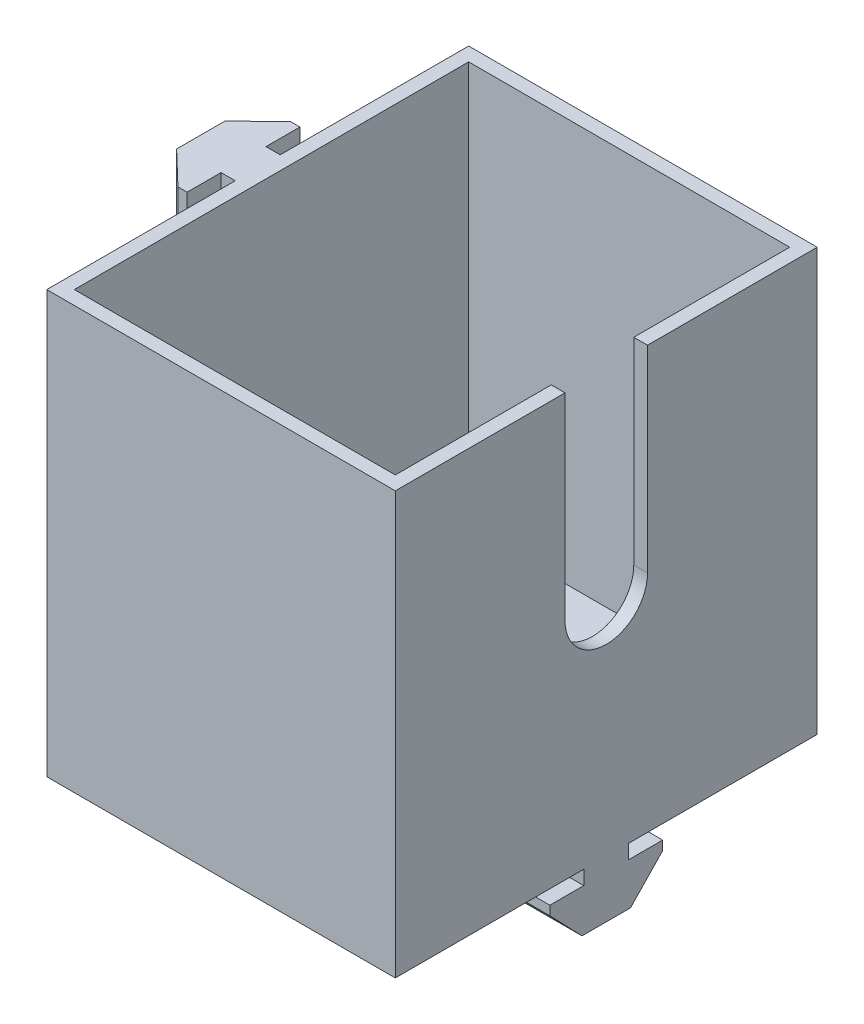
ISO-10303-21;
HEADER;
FILE_DESCRIPTION(('STEP AP214'),'2;1');
FILE_NAME('part.step','',(''),(''),'','','');
FILE_SCHEMA(('AUTOMOTIVE_DESIGN { 1 0 10303 214 1 1 1 1 }'));
ENDSEC;
DATA;
#1=APPLICATION_CONTEXT('core data for automotive mechanical design processes');
#2=APPLICATION_PROTOCOL_DEFINITION('international standard','automotive_design',2000,#1);
#3=PRODUCT_CONTEXT('',#1,'mechanical');
#4=PRODUCT('Part','Part','',(#3));
#5=PRODUCT_RELATED_PRODUCT_CATEGORY('part','',(#4));
#6=PRODUCT_DEFINITION_FORMATION('','',#4);
#7=PRODUCT_DEFINITION_CONTEXT('part definition',#1,'design');
#8=PRODUCT_DEFINITION('design','',#6,#7);
#9=PRODUCT_DEFINITION_SHAPE('','',#8);
#10=(LENGTH_UNIT() NAMED_UNIT(*) SI_UNIT(.MILLI.,.METRE.));
#11=(NAMED_UNIT(*) PLANE_ANGLE_UNIT() SI_UNIT($,.RADIAN.));
#12=(NAMED_UNIT(*) SI_UNIT($,.STERADIAN.) SOLID_ANGLE_UNIT());
#13=UNCERTAINTY_MEASURE_WITH_UNIT(LENGTH_MEASURE(1.E-05),#10,'distance_accuracy_value','');
#14=(GEOMETRIC_REPRESENTATION_CONTEXT(3) GLOBAL_UNCERTAINTY_ASSIGNED_CONTEXT((#13)) GLOBAL_UNIT_ASSIGNED_CONTEXT((#10,
#11,#12)) REPRESENTATION_CONTEXT('',''));
#15=CARTESIAN_POINT('',(0.,0.,0.));
#16=DIRECTION('',(0.,0.,1.));
#17=DIRECTION('',(1.,0.,0.));
#18=AXIS2_PLACEMENT_3D('',#15,#16,#17);
#19=CARTESIAN_POINT('',(22.1,26.1,52.2));
#20=DIRECTION('',(-1.,0.,0.));
#21=DIRECTION('',(0.,-1.,0.));
#22=AXIS2_PLACEMENT_3D('',#19,#20,#21);
#23=PLANE('',#22);
#24=CARTESIAN_POINT('',(22.1,4.6,26.1));
#25=DIRECTION('',(-1.,0.,0.));
#26=DIRECTION('',(0.,-1.,0.));
#27=AXIS2_PLACEMENT_3D('',#24,#25,#26);
#28=CIRCLE('',#27,4.5);
#29=CARTESIAN_POINT('',(22.1,4.6,21.6));
#30=VERTEX_POINT('',#29);
#31=CARTESIAN_POINT('',(22.1,4.6,30.6));
#32=VERTEX_POINT('',#31);
#33=EDGE_CURVE('E53',#30,#32,#28,.T.);
#34=ORIENTED_EDGE('',*,*,#33,.T.);
#35=DIRECTION('',(0.,1.,0.));
#36=VECTOR('',#35,1.);
#37=CARTESIAN_POINT('',(22.1,26.1,30.6));
#38=LINE('',#37,#36);
#39=CARTESIAN_POINT('',(22.1,26.1,30.6));
#40=VERTEX_POINT('',#39);
#41=EDGE_CURVE('E258',#32,#40,#38,.T.);
#42=ORIENTED_EDGE('',*,*,#41,.T.);
#43=DIRECTION('',(0.,0.,-1.));
#44=VECTOR('',#43,1.);
#45=CARTESIAN_POINT('',(22.1,26.1,52.2));
#46=LINE('',#45,#44);
#47=CARTESIAN_POINT('',(22.1,26.1,49.1));
#48=VERTEX_POINT('',#47);
#49=EDGE_CURVE('E41',#48,#40,#46,.T.);
#50=ORIENTED_EDGE('',*,*,#49,.F.);
#51=DIRECTION('',(0.,-1.,0.));
#52=VECTOR('',#51,1.);
#53=CARTESIAN_POINT('',(22.1,198.903184518172,49.1));
#54=LINE('',#53,#52);
#55=CARTESIAN_POINT('',(22.1,-19.9,49.1));
#56=VERTEX_POINT('',#55);
#57=EDGE_CURVE('E315',#48,#56,#54,.T.);
#58=ORIENTED_EDGE('',*,*,#57,.T.);
#59=DIRECTION('',(0.,0.,1.));
#60=VECTOR('',#59,1.);
#61=CARTESIAN_POINT('',(22.1,-19.9,52.2));
#62=LINE('',#61,#60);
#63=CARTESIAN_POINT('',(22.1000000000001,-19.9,28.55));
#64=VERTEX_POINT('',#63);
#65=EDGE_CURVE('E446',#64,#56,#62,.T.);
#66=ORIENTED_EDGE('',*,*,#65,.F.);
#67=DIRECTION('',(0.,1.,0.));
#68=VECTOR('',#67,1.);
#69=CARTESIAN_POINT('',(22.1,-19.9,28.55));
#70=LINE('',#69,#68);
#71=CARTESIAN_POINT('',(22.1000000000001,-21.45,28.55));
#72=VERTEX_POINT('',#71);
#73=EDGE_CURVE('E455',#72,#64,#70,.T.);
#74=ORIENTED_EDGE('',*,*,#73,.F.);
#75=DIRECTION('',(0.,0.,-1.));
#76=VECTOR('',#75,1.);
#77=CARTESIAN_POINT('',(22.1,-21.45,28.55));
#78=LINE('',#77,#76);
#79=CARTESIAN_POINT('',(22.1000000000001,-21.45,32.25));
#80=VERTEX_POINT('',#79);
#81=EDGE_CURVE('E452',#80,#72,#78,.T.);
#82=ORIENTED_EDGE('',*,*,#81,.F.);
#83=DIRECTION('',(0.,1.,0.));
#84=VECTOR('',#83,1.);
#85=CARTESIAN_POINT('',(22.1,-21.45,32.25));
#86=LINE('',#85,#84);
#87=CARTESIAN_POINT('',(22.1000000000001,-22.45,32.25));
#88=VERTEX_POINT('',#87);
#89=EDGE_CURVE('E449',#88,#80,#86,.T.);
#90=ORIENTED_EDGE('',*,*,#89,.F.);
#91=DIRECTION('',(0.,0.721343873517787,0.692577083174397));
#92=VECTOR('',#91,1.);
#93=CARTESIAN_POINT('',(22.1,-22.45,32.25));
#94=LINE('',#93,#92);
#95=CARTESIAN_POINT('',(22.1000000000001,-26.1,28.7455599591376));
#96=VERTEX_POINT('',#95);
#97=EDGE_CURVE('E441',#96,#88,#94,.T.);
#98=ORIENTED_EDGE('',*,*,#97,.F.);
#99=DIRECTION('',(0.,0.,-1.));
#100=VECTOR('',#99,1.);
#101=CARTESIAN_POINT('',(22.1,-26.1,52.2));
#102=LINE('',#101,#100);
#103=CARTESIAN_POINT('',(22.1,-26.1,23.4544400408625));
#104=VERTEX_POINT('',#103);
#105=EDGE_CURVE('E473',#96,#104,#102,.T.);
#106=ORIENTED_EDGE('',*,*,#105,.T.);
#107=DIRECTION('',(0.,0.721343873517786,-0.692577083174397));
#108=VECTOR('',#107,1.);
#109=CARTESIAN_POINT('',(22.1,-22.45,19.95));
#110=LINE('',#109,#108);
#111=CARTESIAN_POINT('',(22.1,-22.45,19.95));
#112=VERTEX_POINT('',#111);
#113=EDGE_CURVE('E416',#104,#112,#110,.T.);
#114=ORIENTED_EDGE('',*,*,#113,.T.);
#115=DIRECTION('',(0.,1.,0.));
#116=VECTOR('',#115,1.);
#117=CARTESIAN_POINT('',(22.1,-21.45,19.95));
#118=LINE('',#117,#116);
#119=CARTESIAN_POINT('',(22.1,-21.45,19.95));
#120=VERTEX_POINT('',#119);
#121=EDGE_CURVE('E418',#112,#120,#118,.T.);
#122=ORIENTED_EDGE('',*,*,#121,.T.);
#123=DIRECTION('',(0.,0.,1.));
#124=VECTOR('',#123,1.);
#125=CARTESIAN_POINT('',(22.1,-21.45,23.65));
#126=LINE('',#125,#124);
#127=CARTESIAN_POINT('',(22.1,-21.45,23.65));
#128=VERTEX_POINT('',#127);
#129=EDGE_CURVE('E420',#120,#128,#126,.T.);
#130=ORIENTED_EDGE('',*,*,#129,.T.);
#131=DIRECTION('',(0.,1.,0.));
#132=VECTOR('',#131,1.);
#133=CARTESIAN_POINT('',(22.1,-19.9,23.65));
#134=LINE('',#133,#132);
#135=CARTESIAN_POINT('',(22.1,-19.9,23.65));
#136=VERTEX_POINT('',#135);
#137=EDGE_CURVE('E422',#128,#136,#134,.T.);
#138=ORIENTED_EDGE('',*,*,#137,.T.);
#139=DIRECTION('',(0.,0.,-1.));
#140=VECTOR('',#139,1.);
#141=CARTESIAN_POINT('',(22.1,-19.9,0.));
#142=LINE('',#141,#140);
#143=CARTESIAN_POINT('',(22.1,-19.9,3.1));
#144=VERTEX_POINT('',#143);
#145=EDGE_CURVE('E424',#136,#144,#142,.T.);
#146=ORIENTED_EDGE('',*,*,#145,.T.);
#147=DIRECTION('',(0.,-1.,0.));
#148=VECTOR('',#147,1.);
#149=CARTESIAN_POINT('',(22.1,188.847401986937,3.1));
#150=LINE('',#149,#148);
#151=CARTESIAN_POINT('',(22.1,26.1,3.1));
#152=VERTEX_POINT('',#151);
#153=EDGE_CURVE('E305',#152,#144,#150,.T.);
#154=ORIENTED_EDGE('',*,*,#153,.F.);
#155=CARTESIAN_POINT('',(22.1,26.1,21.6));
#156=VERTEX_POINT('',#155);
#157=EDGE_CURVE('E479',#156,#152,#46,.T.);
#158=ORIENTED_EDGE('',*,*,#157,.F.);
#159=DIRECTION('',(0.,-1.,0.));
#160=VECTOR('',#159,1.);
#161=CARTESIAN_POINT('',(22.1,26.1,21.6));
#162=LINE('',#161,#160);
#163=EDGE_CURVE('E49',#156,#30,#162,.T.);
#164=ORIENTED_EDGE('',*,*,#163,.T.);
#165=EDGE_LOOP('',(#34,#42,#50,#58,#66,#74,#82,#90,#98,#106,#114,#122,#130,#138,#146,#154,#158,#164));
#166=FACE_BOUND('',#165,.T.);
#167=ADVANCED_FACE('F33',(#166),#23,.F.);
#168=CARTESIAN_POINT('',(129.653184518172,-19.9,0.));
#169=DIRECTION('',(0.,-1.,0.));
#170=DIRECTION('',(1.,0.,0.));
#171=AXIS2_PLACEMENT_3D('',#168,#169,#170);
#172=PLANE('',#171);
#173=DIRECTION('',(0.,0.,-1.));
#174=VECTOR('',#173,1.);
#175=CARTESIAN_POINT('',(-15.9,-19.9,0.));
#176=LINE('',#175,#174);
#177=CARTESIAN_POINT('',(-15.9,-19.9,23.65));
#178=VERTEX_POINT('',#177);
#179=CARTESIAN_POINT('',(-15.9,-19.9,3.1));
#180=VERTEX_POINT('',#179);
#181=EDGE_CURVE('E344',#178,#180,#176,.T.);
#182=ORIENTED_EDGE('',*,*,#181,.T.);
#183=DIRECTION('',(1.,0.,0.));
#184=VECTOR('',#183,1.);
#185=CARTESIAN_POINT('',(22.1,-19.9,3.1));
#186=LINE('',#185,#184);
#187=EDGE_CURVE('E298',#180,#144,#186,.T.);
#188=ORIENTED_EDGE('',*,*,#187,.T.);
#189=ORIENTED_EDGE('',*,*,#145,.F.);
#190=DIRECTION('',(-1.,0.,0.));
#191=VECTOR('',#190,1.);
#192=CARTESIAN_POINT('',(129.653184518172,-19.9,23.65));
#193=LINE('',#192,#191);
#194=EDGE_CURVE('E427',#136,#178,#193,.T.);
#195=ORIENTED_EDGE('',*,*,#194,.T.);
#196=EDGE_LOOP('',(#182,#188,#189,#195));
#197=FACE_BOUND('',#196,.T.);
#198=ADVANCED_FACE('F547',(#197),#172,.T.);
#199=CARTESIAN_POINT('',(-22.1,26.1,52.2));
#200=DIRECTION('',(0.,-1.,0.));
#201=DIRECTION('',(0.,0.,-1.));
#202=AXIS2_PLACEMENT_3D('',#199,#200,#201);
#203=PLANE('',#202);
#204=ORIENTED_EDGE('',*,*,#157,.T.);
#205=DIRECTION('',(1.,0.,0.));
#206=VECTOR('',#205,1.);
#207=CARTESIAN_POINT('',(22.1,26.1,3.1));
#208=LINE('',#207,#206);
#209=CARTESIAN_POINT('',(-15.9,26.1,3.1));
#210=VERTEX_POINT('',#209);
#211=EDGE_CURVE('E291',#210,#152,#208,.T.);
#212=ORIENTED_EDGE('',*,*,#211,.F.);
#213=DIRECTION('',(0.,0.,-1.));
#214=VECTOR('',#213,1.);
#215=CARTESIAN_POINT('',(-15.9,26.1,0.));
#216=LINE('',#215,#214);
#217=CARTESIAN_POINT('',(-15.9,26.1,23.65));
#218=VERTEX_POINT('',#217);
#219=EDGE_CURVE('E348',#218,#210,#216,.T.);
#220=ORIENTED_EDGE('',*,*,#219,.F.);
#221=DIRECTION('',(1.,0.,0.));
#222=VECTOR('',#221,1.);
#223=CARTESIAN_POINT('',(-15.9,26.1,23.65));
#224=LINE('',#223,#222);
#225=CARTESIAN_POINT('',(-17.45,26.1,23.65));
#226=VERTEX_POINT('',#225);
#227=EDGE_CURVE('E362',#226,#218,#224,.T.);
#228=ORIENTED_EDGE('',*,*,#227,.F.);
#229=DIRECTION('',(0.,0.,1.));
#230=VECTOR('',#229,1.);
#231=CARTESIAN_POINT('',(-17.45,26.1,23.65));
#232=LINE('',#231,#230);
#233=CARTESIAN_POINT('',(-17.45,26.1,19.95));
#234=VERTEX_POINT('',#233);
#235=EDGE_CURVE('E359',#234,#226,#232,.T.);
#236=ORIENTED_EDGE('',*,*,#235,.F.);
#237=DIRECTION('',(1.,0.,0.));
#238=VECTOR('',#237,1.);
#239=CARTESIAN_POINT('',(-17.45,26.1,19.95));
#240=LINE('',#239,#238);
#241=CARTESIAN_POINT('',(-18.45,26.1,19.95));
#242=VERTEX_POINT('',#241);
#243=EDGE_CURVE('E356',#242,#234,#240,.T.);
#244=ORIENTED_EDGE('',*,*,#243,.F.);
#245=DIRECTION('',(0.721343873517788,0.,-0.692577083174396));
#246=VECTOR('',#245,1.);
#247=CARTESIAN_POINT('',(-18.45,26.1,19.95));
#248=LINE('',#247,#246);
#249=CARTESIAN_POINT('',(-22.1,26.1,23.4544400408624));
#250=VERTEX_POINT('',#249);
#251=EDGE_CURVE('E341',#250,#242,#248,.T.);
#252=ORIENTED_EDGE('',*,*,#251,.F.);
#253=DIRECTION('',(0.,0.,-1.));
#254=VECTOR('',#253,1.);
#255=CARTESIAN_POINT('',(-22.1,26.1,52.2));
#256=LINE('',#255,#254);
#257=CARTESIAN_POINT('',(-22.1,26.1,28.7455599591376));
#258=VERTEX_POINT('',#257);
#259=EDGE_CURVE('E476',#258,#250,#256,.T.);
#260=ORIENTED_EDGE('',*,*,#259,.F.);
#261=DIRECTION('',(0.721343873517787,0.,0.692577083174397));
#262=VECTOR('',#261,1.);
#263=CARTESIAN_POINT('',(-18.45,26.1,32.25));
#264=LINE('',#263,#262);
#265=CARTESIAN_POINT('',(-18.45,26.1,32.25));
#266=VERTEX_POINT('',#265);
#267=EDGE_CURVE('E382',#258,#266,#264,.T.);
#268=ORIENTED_EDGE('',*,*,#267,.T.);
#269=DIRECTION('',(1.,0.,0.));
#270=VECTOR('',#269,1.);
#271=CARTESIAN_POINT('',(-17.45,26.1,32.25));
#272=LINE('',#271,#270);
#273=CARTESIAN_POINT('',(-17.45,26.1,32.25));
#274=VERTEX_POINT('',#273);
#275=EDGE_CURVE('E393',#266,#274,#272,.T.);
#276=ORIENTED_EDGE('',*,*,#275,.T.);
#277=DIRECTION('',(0.,0.,-1.));
#278=VECTOR('',#277,1.);
#279=CARTESIAN_POINT('',(-17.45,26.1,28.55));
#280=LINE('',#279,#278);
#281=CARTESIAN_POINT('',(-17.45,26.1,28.55));
#282=VERTEX_POINT('',#281);
#283=EDGE_CURVE('E395',#274,#282,#280,.T.);
#284=ORIENTED_EDGE('',*,*,#283,.T.);
#285=DIRECTION('',(1.,0.,0.));
#286=VECTOR('',#285,1.);
#287=CARTESIAN_POINT('',(-15.9,26.1,28.55));
#288=LINE('',#287,#286);
#289=CARTESIAN_POINT('',(-15.9,26.1,28.55));
#290=VERTEX_POINT('',#289);
#291=EDGE_CURVE('E397',#282,#290,#288,.T.);
#292=ORIENTED_EDGE('',*,*,#291,.T.);
#293=DIRECTION('',(0.,0.,1.));
#294=VECTOR('',#293,1.);
#295=CARTESIAN_POINT('',(-15.9,26.1,52.2));
#296=LINE('',#295,#294);
#297=CARTESIAN_POINT('',(-15.9,26.1,49.1));
#298=VERTEX_POINT('',#297);
#299=EDGE_CURVE('E386',#290,#298,#296,.T.);
#300=ORIENTED_EDGE('',*,*,#299,.T.);
#301=DIRECTION('',(1.,0.,0.));
#302=VECTOR('',#301,1.);
#303=CARTESIAN_POINT('',(22.1,26.1,49.1));
#304=LINE('',#303,#302);
#305=EDGE_CURVE('E307',#298,#48,#304,.T.);
#306=ORIENTED_EDGE('',*,*,#305,.T.);
#307=ORIENTED_EDGE('',*,*,#49,.T.);
#308=DIRECTION('',(-1.,0.,0.));
#309=VECTOR('',#308,1.);
#310=CARTESIAN_POINT('',(172.635794751145,26.1,30.6));
#311=LINE('',#310,#309);
#312=CARTESIAN_POINT('',(20.6,26.1,30.6));
#313=VERTEX_POINT('',#312);
#314=EDGE_CURVE('E259',#40,#313,#311,.T.);
#315=ORIENTED_EDGE('',*,*,#314,.T.);
#316=DIRECTION('',(0.,0.,-1.));
#317=VECTOR('',#316,1.);
#318=CARTESIAN_POINT('',(20.6,26.1,47.6));
#319=LINE('',#318,#317);
#320=CARTESIAN_POINT('',(20.6,26.1,47.6));
#321=VERTEX_POINT('',#320);
#322=EDGE_CURVE('E242',#321,#313,#319,.T.);
#323=ORIENTED_EDGE('',*,*,#322,.F.);
#324=DIRECTION('',(1.,0.,0.));
#325=VECTOR('',#324,1.);
#326=CARTESIAN_POINT('',(-14.4,26.1,47.6));
#327=LINE('',#326,#325);
#328=CARTESIAN_POINT('',(-14.4,26.1,47.6));
#329=VERTEX_POINT('',#328);
#330=EDGE_CURVE('E283',#329,#321,#327,.T.);
#331=ORIENTED_EDGE('',*,*,#330,.F.);
#332=DIRECTION('',(0.,0.,1.));
#333=VECTOR('',#332,1.);
#334=CARTESIAN_POINT('',(-14.4,26.1,4.60000000000001));
#335=LINE('',#334,#333);
#336=CARTESIAN_POINT('',(-14.4,26.1,4.60000000000001));
#337=VERTEX_POINT('',#336);
#338=EDGE_CURVE('E280',#337,#329,#335,.T.);
#339=ORIENTED_EDGE('',*,*,#338,.F.);
#340=DIRECTION('',(-1.,0.,0.));
#341=VECTOR('',#340,1.);
#342=CARTESIAN_POINT('',(20.6,26.1,4.6));
#343=LINE('',#342,#341);
#344=CARTESIAN_POINT('',(20.6,26.1,4.6));
#345=VERTEX_POINT('',#344);
#346=EDGE_CURVE('E261',#345,#337,#343,.T.);
#347=ORIENTED_EDGE('',*,*,#346,.F.);
#348=CARTESIAN_POINT('',(20.6,26.1,21.6));
#349=VERTEX_POINT('',#348);
#350=EDGE_CURVE('E286',#349,#345,#319,.T.);
#351=ORIENTED_EDGE('',*,*,#350,.F.);
#352=DIRECTION('',(-1.,0.,0.));
#353=VECTOR('',#352,1.);
#354=CARTESIAN_POINT('',(172.635794751145,26.1,21.6));
#355=LINE('',#354,#353);
#356=EDGE_CURVE('E246',#156,#349,#355,.T.);
#357=ORIENTED_EDGE('',*,*,#356,.F.);
#358=EDGE_LOOP('',(#204,#212,#220,#228,#236,#244,#252,#260,#268,#276,#284,#292,#300,#306,#307,
#315,#323,#331,#339,#347,#351,#357));
#359=FACE_BOUND('',#358,.T.);
#360=ADVANCED_FACE('F495',(#359),#203,.F.);
#361=CARTESIAN_POINT('',(129.653184518172,-19.9,52.2));
#362=DIRECTION('',(0.,1.,0.));
#363=DIRECTION('',(-1.,0.,0.));
#364=AXIS2_PLACEMENT_3D('',#361,#362,#363);
#365=PLANE('',#364);
#366=DIRECTION('',(1.,0.,0.));
#367=VECTOR('',#366,1.);
#368=CARTESIAN_POINT('',(22.1,-19.9,49.1));
#369=LINE('',#368,#367);
#370=CARTESIAN_POINT('',(-15.9,-19.9,49.1));
#371=VERTEX_POINT('',#370);
#372=EDGE_CURVE('E308',#371,#56,#369,.T.);
#373=ORIENTED_EDGE('',*,*,#372,.F.);
#374=DIRECTION('',(0.,0.,1.));
#375=VECTOR('',#374,1.);
#376=CARTESIAN_POINT('',(-15.9,-19.9,52.2));
#377=LINE('',#376,#375);
#378=CARTESIAN_POINT('',(-15.8999999999999,-19.9,28.55));
#379=VERTEX_POINT('',#378);
#380=EDGE_CURVE('E383',#379,#371,#377,.T.);
#381=ORIENTED_EDGE('',*,*,#380,.F.);
#382=DIRECTION('',(-1.,0.,0.));
#383=VECTOR('',#382,1.);
#384=CARTESIAN_POINT('',(129.653184518172,-19.9,28.55));
#385=LINE('',#384,#383);
#386=EDGE_CURVE('E445',#64,#379,#385,.T.);
#387=ORIENTED_EDGE('',*,*,#386,.F.);
#388=ORIENTED_EDGE('',*,*,#65,.T.);
#389=EDGE_LOOP('',(#373,#381,#387,#388));
#390=FACE_BOUND('',#389,.T.);
#391=ADVANCED_FACE('F526',(#390),#365,.F.);
#392=CARTESIAN_POINT('',(-22.1,-26.1,52.2));
#393=DIRECTION('',(0.,1.,0.));
#394=DIRECTION('',(0.,0.,1.));
#395=AXIS2_PLACEMENT_3D('',#392,#393,#394);
#396=PLANE('',#395);
#397=DIRECTION('',(0.,0.,1.));
#398=VECTOR('',#397,1.);
#399=CARTESIAN_POINT('',(-15.8999999999999,-26.1,52.2));
#400=LINE('',#399,#398);
#401=CARTESIAN_POINT('',(-15.8999999999999,-26.1,28.7455599591376));
#402=VERTEX_POINT('',#401);
#403=CARTESIAN_POINT('',(-15.8999999999999,-26.1,23.4544400408624));
#404=VERTEX_POINT('',#403);
#405=EDGE_CURVE('E36',#402,#404,#400,.F.);
#406=ORIENTED_EDGE('',*,*,#405,.T.);
#407=DIRECTION('',(-1.,0.,0.));
#408=VECTOR('',#407,1.);
#409=CARTESIAN_POINT('',(129.653184518172,-26.1,23.4544400408624));
#410=LINE('',#409,#408);
#411=EDGE_CURVE('E435',#104,#404,#410,.T.);
#412=ORIENTED_EDGE('',*,*,#411,.F.);
#413=ORIENTED_EDGE('',*,*,#105,.F.);
#414=DIRECTION('',(-1.,0.,0.));
#415=VECTOR('',#414,1.);
#416=CARTESIAN_POINT('',(129.653184518172,-26.1,28.7455599591376));
#417=LINE('',#416,#415);
#418=EDGE_CURVE('E468',#96,#402,#417,.T.);
#419=ORIENTED_EDGE('',*,*,#418,.T.);
#420=EDGE_LOOP('',(#406,#412,#413,#419));
#421=FACE_BOUND('',#420,.T.);
#422=ADVANCED_FACE('F578',(#421),#396,.F.);
#423=CARTESIAN_POINT('',(129.653184518172,-22.45,19.95));
#424=DIRECTION('',(0.,-0.692577083174397,-0.721343873517786));
#425=DIRECTION('',(0.,0.721343873517786,-0.692577083174397));
#426=AXIS2_PLACEMENT_3D('',#423,#424,#425);
#427=PLANE('',#426);
#428=ORIENTED_EDGE('',*,*,#411,.T.);
#429=DIRECTION('',(0.,-0.721343873517786,0.692577083174397));
#430=VECTOR('',#429,1.);
#431=CARTESIAN_POINT('',(-15.8999999999999,-22.45,19.95));
#432=LINE('',#431,#430);
#433=CARTESIAN_POINT('',(-15.8999999999999,-22.45,19.95));
#434=VERTEX_POINT('',#433);
#435=EDGE_CURVE('E331',#434,#404,#432,.T.);
#436=ORIENTED_EDGE('',*,*,#435,.F.);
#437=DIRECTION('',(-1.,0.,0.));
#438=VECTOR('',#437,1.);
#439=CARTESIAN_POINT('',(129.653184518172,-22.45,19.95));
#440=LINE('',#439,#438);
#441=EDGE_CURVE('E438',#112,#434,#440,.T.);
#442=ORIENTED_EDGE('',*,*,#441,.F.);
#443=ORIENTED_EDGE('',*,*,#113,.F.);
#444=EDGE_LOOP('',(#428,#436,#442,#443));
#445=FACE_BOUND('',#444,.T.);
#446=ADVANCED_FACE('F571',(#445),#427,.T.);
#447=CARTESIAN_POINT('',(-22.1,26.1,52.2));
#448=DIRECTION('',(1.,0.,0.));
#449=DIRECTION('',(0.,1.,0.));
#450=AXIS2_PLACEMENT_3D('',#447,#448,#449);
#451=PLANE('',#450);
#452=DIRECTION('',(0.,-1.,0.));
#453=VECTOR('',#452,1.);
#454=CARTESIAN_POINT('',(-22.1,133.653184518172,23.4544400408624));
#455=LINE('',#454,#453);
#456=CARTESIAN_POINT('',(-22.1,-19.9,23.4544400408624));
#457=VERTEX_POINT('',#456);
#458=EDGE_CURVE('E376',#250,#457,#455,.T.);
#459=ORIENTED_EDGE('',*,*,#458,.T.);
#460=DIRECTION('',(0.,0.,1.));
#461=VECTOR('',#460,1.);
#462=CARTESIAN_POINT('',(-22.1,-19.9,52.2));
#463=LINE('',#462,#461);
#464=CARTESIAN_POINT('',(-22.1,-19.9,28.7455599591376));
#465=VERTEX_POINT('',#464);
#466=EDGE_CURVE('E442',#457,#465,#463,.T.);
#467=ORIENTED_EDGE('',*,*,#466,.T.);
#468=DIRECTION('',(0.,-1.,0.));
#469=VECTOR('',#468,1.);
#470=CARTESIAN_POINT('',(-22.1,198.903184518172,28.7455599591376));
#471=LINE('',#470,#469);
#472=EDGE_CURVE('E410',#258,#465,#471,.T.);
#473=ORIENTED_EDGE('',*,*,#472,.F.);
#474=ORIENTED_EDGE('',*,*,#259,.T.);
#475=EDGE_LOOP('',(#459,#467,#473,#474));
#476=FACE_BOUND('',#475,.T.);
#477=ADVANCED_FACE('F569',(#476),#451,.F.);
#478=CARTESIAN_POINT('',(129.653184518172,-19.9,28.55));
#479=DIRECTION('',(0.,0.,-1.));
#480=DIRECTION('',(0.,1.,0.));
#481=AXIS2_PLACEMENT_3D('',#478,#479,#480);
#482=PLANE('',#481);
#483=DIRECTION('',(0.,-1.,0.));
#484=VECTOR('',#483,1.);
#485=CARTESIAN_POINT('',(-17.45,198.903184518172,28.55));
#486=LINE('',#485,#484);
#487=CARTESIAN_POINT('',(-17.4499999999999,-19.9,28.55));
#488=VERTEX_POINT('',#487);
#489=EDGE_CURVE('E404',#282,#488,#486,.T.);
#490=ORIENTED_EDGE('',*,*,#489,.T.);
#491=DIRECTION('',(1.,0.,0.));
#492=VECTOR('',#491,1.);
#493=CARTESIAN_POINT('',(129.653184518172,-19.9,28.55));
#494=LINE('',#493,#492);
#495=EDGE_CURVE('E323',#488,#379,#494,.T.);
#496=ORIENTED_EDGE('',*,*,#495,.T.);
#497=DIRECTION('',(0.,-1.,0.));
#498=VECTOR('',#497,1.);
#499=CARTESIAN_POINT('',(-15.9,198.903184518172,28.55));
#500=LINE('',#499,#498);
#501=EDGE_CURVE('E401',#290,#379,#500,.T.);
#502=ORIENTED_EDGE('',*,*,#501,.F.);
#503=ORIENTED_EDGE('',*,*,#291,.F.);
#504=EDGE_LOOP('',(#490,#496,#502,#503));
#505=FACE_BOUND('',#504,.T.);
#506=ADVANCED_FACE('F503',(#505),#482,.F.);
#507=CARTESIAN_POINT('',(129.653184518172,-19.9,23.65));
#508=DIRECTION('',(0.,0.,-1.));
#509=DIRECTION('',(-1.,0.,0.));
#510=AXIS2_PLACEMENT_3D('',#507,#508,#509);
#511=PLANE('',#510);
#512=DIRECTION('',(1.,0.,0.));
#513=VECTOR('',#512,1.);
#514=CARTESIAN_POINT('',(129.653184518172,-19.9,23.65));
#515=LINE('',#514,#513);
#516=CARTESIAN_POINT('',(-17.45,-19.9,23.65));
#517=VERTEX_POINT('',#516);
#518=EDGE_CURVE('E320',#517,#178,#515,.T.);
#519=ORIENTED_EDGE('',*,*,#518,.F.);
#520=DIRECTION('',(0.,-1.,0.));
#521=VECTOR('',#520,1.);
#522=CARTESIAN_POINT('',(-17.45,133.653184518172,23.65));
#523=LINE('',#522,#521);
#524=EDGE_CURVE('E370',#226,#517,#523,.T.);
#525=ORIENTED_EDGE('',*,*,#524,.F.);
#526=ORIENTED_EDGE('',*,*,#227,.T.);
#527=DIRECTION('',(0.,-1.,0.));
#528=VECTOR('',#527,1.);
#529=CARTESIAN_POINT('',(-15.9,133.653184518172,23.65));
#530=LINE('',#529,#528);
#531=EDGE_CURVE('E367',#218,#178,#530,.T.);
#532=ORIENTED_EDGE('',*,*,#531,.T.);
#533=EDGE_LOOP('',(#519,#525,#526,#532));
#534=FACE_BOUND('',#533,.T.);
#535=ADVANCED_FACE('F554',(#534),#511,.T.);
#536=DIRECTION('',(0.,0.,-1.));
#537=VECTOR('',#536,1.);
#538=CARTESIAN_POINT('',(-17.45,-19.9,28.55));
#539=LINE('',#538,#537);
#540=CARTESIAN_POINT('',(-17.45,-19.9,32.25));
#541=VERTEX_POINT('',#540);
#542=EDGE_CURVE('E385',#541,#488,#539,.T.);
#543=ORIENTED_EDGE('',*,*,#542,.F.);
#544=DIRECTION('',(1.,0.,0.));
#545=VECTOR('',#544,1.);
#546=CARTESIAN_POINT('',(-17.45,-19.9,32.25));
#547=LINE('',#546,#545);
#548=CARTESIAN_POINT('',(-18.45,-19.9,32.25));
#549=VERTEX_POINT('',#548);
#550=EDGE_CURVE('E388',#549,#541,#547,.T.);
#551=ORIENTED_EDGE('',*,*,#550,.F.);
#552=DIRECTION('',(0.721343873517787,0.,0.692577083174397));
#553=VECTOR('',#552,1.);
#554=CARTESIAN_POINT('',(-18.45,-19.9,32.25));
#555=LINE('',#554,#553);
#556=EDGE_CURVE('E391',#465,#549,#555,.T.);
#557=ORIENTED_EDGE('',*,*,#556,.F.);
#558=ORIENTED_EDGE('',*,*,#466,.F.);
#559=DIRECTION('',(0.721343873517788,0.,-0.692577083174396));
#560=VECTOR('',#559,1.);
#561=CARTESIAN_POINT('',(-18.45,-19.9,19.95));
#562=LINE('',#561,#560);
#563=CARTESIAN_POINT('',(-18.45,-19.9,19.95));
#564=VERTEX_POINT('',#563);
#565=EDGE_CURVE('E353',#457,#564,#562,.T.);
#566=ORIENTED_EDGE('',*,*,#565,.T.);
#567=DIRECTION('',(1.,0.,0.));
#568=VECTOR('',#567,1.);
#569=CARTESIAN_POINT('',(-17.45,-19.9,19.95));
#570=LINE('',#569,#568);
#571=CARTESIAN_POINT('',(-17.45,-19.9,19.95));
#572=VERTEX_POINT('',#571);
#573=EDGE_CURVE('E351',#564,#572,#570,.T.);
#574=ORIENTED_EDGE('',*,*,#573,.T.);
#575=DIRECTION('',(0.,0.,1.));
#576=VECTOR('',#575,1.);
#577=CARTESIAN_POINT('',(-17.45,-19.9,23.65));
#578=LINE('',#577,#576);
#579=EDGE_CURVE('E347',#572,#517,#578,.T.);
#580=ORIENTED_EDGE('',*,*,#579,.T.);
#581=ORIENTED_EDGE('',*,*,#518,.T.);
#582=DIRECTION('',(0.,0.,-1.));
#583=VECTOR('',#582,1.);
#584=CARTESIAN_POINT('',(-15.8999999999999,-19.9,171.790684518172));
#585=LINE('',#584,#583);
#586=EDGE_CURVE('E317',#379,#178,#585,.T.);
#587=ORIENTED_EDGE('',*,*,#586,.F.);
#588=ORIENTED_EDGE('',*,*,#495,.F.);
#589=EDGE_LOOP('',(#543,#551,#557,#558,#566,#574,#580,#581,#587,#588));
#590=FACE_BOUND('',#589,.T.);
#591=ADVANCED_FACE('F507',(#590),#365,.F.);
#592=CARTESIAN_POINT('',(129.653184518172,-22.45,32.25));
#593=DIRECTION('',(0.,0.692577083174397,-0.721343873517787));
#594=DIRECTION('',(0.,0.721343873517787,0.692577083174397));
#595=AXIS2_PLACEMENT_3D('',#592,#593,#594);
#596=PLANE('',#595);
#597=DIRECTION('',(0.,-0.721343873517787,-0.692577083174397));
#598=VECTOR('',#597,1.);
#599=CARTESIAN_POINT('',(-15.8999999999999,-22.45,32.25));
#600=LINE('',#599,#598);
#601=CARTESIAN_POINT('',(-15.8999999999999,-22.45,32.25));
#602=VERTEX_POINT('',#601);
#603=EDGE_CURVE('E338',#602,#402,#600,.T.);
#604=ORIENTED_EDGE('',*,*,#603,.T.);
#605=ORIENTED_EDGE('',*,*,#418,.F.);
#606=ORIENTED_EDGE('',*,*,#97,.T.);
#607=DIRECTION('',(-1.,0.,0.));
#608=VECTOR('',#607,1.);
#609=CARTESIAN_POINT('',(129.653184518172,-22.45,32.25));
#610=LINE('',#609,#608);
#611=EDGE_CURVE('E470',#88,#602,#610,.T.);
#612=ORIENTED_EDGE('',*,*,#611,.T.);
#613=EDGE_LOOP('',(#604,#605,#606,#612));
#614=FACE_BOUND('',#613,.T.);
#615=ADVANCED_FACE('F613',(#614),#596,.F.);
#616=CARTESIAN_POINT('',(129.653184518172,-21.45,32.25));
#617=DIRECTION('',(0.,0.,-1.));
#618=DIRECTION('',(-1.,0.,0.));
#619=AXIS2_PLACEMENT_3D('',#616,#617,#618);
#620=PLANE('',#619);
#621=DIRECTION('',(-1.,0.,0.));
#622=VECTOR('',#621,1.);
#623=CARTESIAN_POINT('',(129.653184518172,-21.45,32.25));
#624=LINE('',#623,#622);
#625=CARTESIAN_POINT('',(-15.8999999999999,-21.45,32.25));
#626=VERTEX_POINT('',#625);
#627=EDGE_CURVE('E465',#80,#626,#624,.T.);
#628=ORIENTED_EDGE('',*,*,#627,.T.);
#629=DIRECTION('',(0.,-1.,0.));
#630=VECTOR('',#629,1.);
#631=CARTESIAN_POINT('',(-15.8999999999999,-21.45,32.25));
#632=LINE('',#631,#630);
#633=EDGE_CURVE('E336',#626,#602,#632,.T.);
#634=ORIENTED_EDGE('',*,*,#633,.T.);
#635=ORIENTED_EDGE('',*,*,#611,.F.);
#636=ORIENTED_EDGE('',*,*,#89,.T.);
#637=EDGE_LOOP('',(#628,#634,#635,#636));
#638=FACE_BOUND('',#637,.T.);
#639=ADVANCED_FACE('F610',(#638),#620,.F.);
#640=CARTESIAN_POINT('',(129.653184518172,-21.45,28.55));
#641=DIRECTION('',(0.,-1.,0.));
#642=DIRECTION('',(1.,0.,0.));
#643=AXIS2_PLACEMENT_3D('',#640,#641,#642);
#644=PLANE('',#643);
#645=DIRECTION('',(-1.,0.,0.));
#646=VECTOR('',#645,1.);
#647=CARTESIAN_POINT('',(129.653184518172,-21.45,28.55));
#648=LINE('',#647,#646);
#649=CARTESIAN_POINT('',(-15.8999999999999,-21.45,28.55));
#650=VERTEX_POINT('',#649);
#651=EDGE_CURVE('E462',#72,#650,#648,.T.);
#652=ORIENTED_EDGE('',*,*,#651,.T.);
#653=DIRECTION('',(0.,0.,1.));
#654=VECTOR('',#653,1.);
#655=CARTESIAN_POINT('',(-15.8999999999999,-21.45,28.55));
#656=LINE('',#655,#654);
#657=EDGE_CURVE('E334',#650,#626,#656,.T.);
#658=ORIENTED_EDGE('',*,*,#657,.T.);
#659=ORIENTED_EDGE('',*,*,#627,.F.);
#660=ORIENTED_EDGE('',*,*,#81,.T.);
#661=EDGE_LOOP('',(#652,#658,#659,#660));
#662=FACE_BOUND('',#661,.T.);
#663=ADVANCED_FACE('F517',(#662),#644,.F.);
#664=ORIENTED_EDGE('',*,*,#386,.T.);
#665=DIRECTION('',(0.,-1.,0.));
#666=VECTOR('',#665,1.);
#667=CARTESIAN_POINT('',(-15.8999999999999,-19.9,28.55));
#668=LINE('',#667,#666);
#669=EDGE_CURVE('E332',#379,#650,#668,.T.);
#670=ORIENTED_EDGE('',*,*,#669,.T.);
#671=ORIENTED_EDGE('',*,*,#651,.F.);
#672=ORIENTED_EDGE('',*,*,#73,.T.);
#673=EDGE_LOOP('',(#664,#670,#671,#672));
#674=FACE_BOUND('',#673,.T.);
#675=ADVANCED_FACE('F515',(#674),#482,.F.);
#676=CARTESIAN_POINT('',(129.653184518172,-21.45,19.95));
#677=DIRECTION('',(0.,0.,-1.));
#678=DIRECTION('',(-1.,0.,0.));
#679=AXIS2_PLACEMENT_3D('',#676,#677,#678);
#680=PLANE('',#679);
#681=DIRECTION('',(0.,-1.,0.));
#682=VECTOR('',#681,1.);
#683=CARTESIAN_POINT('',(-15.8999999999999,-21.45,19.95));
#684=LINE('',#683,#682);
#685=CARTESIAN_POINT('',(-15.8999999999999,-21.45,19.95));
#686=VERTEX_POINT('',#685);
#687=EDGE_CURVE('E328',#686,#434,#684,.T.);
#688=ORIENTED_EDGE('',*,*,#687,.F.);
#689=DIRECTION('',(-1.,0.,0.));
#690=VECTOR('',#689,1.);
#691=CARTESIAN_POINT('',(129.653184518172,-21.45,19.95));
#692=LINE('',#691,#690);
#693=EDGE_CURVE('E432',#120,#686,#692,.T.);
#694=ORIENTED_EDGE('',*,*,#693,.F.);
#695=ORIENTED_EDGE('',*,*,#121,.F.);
#696=ORIENTED_EDGE('',*,*,#441,.T.);
#697=EDGE_LOOP('',(#688,#694,#695,#696));
#698=FACE_BOUND('',#697,.T.);
#699=ADVANCED_FACE('F600',(#698),#680,.T.);
#700=CARTESIAN_POINT('',(129.653184518172,-21.45,23.65));
#701=DIRECTION('',(0.,1.,0.));
#702=DIRECTION('',(-1.,0.,0.));
#703=AXIS2_PLACEMENT_3D('',#700,#701,#702);
#704=PLANE('',#703);
#705=DIRECTION('',(0.,0.,-1.));
#706=VECTOR('',#705,1.);
#707=CARTESIAN_POINT('',(-15.8999999999999,-21.45,23.65));
#708=LINE('',#707,#706);
#709=CARTESIAN_POINT('',(-15.8999999999999,-21.45,23.65));
#710=VERTEX_POINT('',#709);
#711=EDGE_CURVE('E325',#710,#686,#708,.T.);
#712=ORIENTED_EDGE('',*,*,#711,.F.);
#713=DIRECTION('',(-1.,0.,0.));
#714=VECTOR('',#713,1.);
#715=CARTESIAN_POINT('',(129.653184518172,-21.45,23.65));
#716=LINE('',#715,#714);
#717=EDGE_CURVE('E430',#128,#710,#716,.T.);
#718=ORIENTED_EDGE('',*,*,#717,.F.);
#719=ORIENTED_EDGE('',*,*,#129,.F.);
#720=ORIENTED_EDGE('',*,*,#693,.T.);
#721=EDGE_LOOP('',(#712,#718,#719,#720));
#722=FACE_BOUND('',#721,.T.);
#723=ADVANCED_FACE('F596',(#722),#704,.T.);
#724=DIRECTION('',(0.,-1.,0.));
#725=VECTOR('',#724,1.);
#726=CARTESIAN_POINT('',(-15.8999999999999,-19.9,23.65));
#727=LINE('',#726,#725);
#728=EDGE_CURVE('E11',#178,#710,#727,.T.);
#729=ORIENTED_EDGE('',*,*,#728,.F.);
#730=ORIENTED_EDGE('',*,*,#194,.F.);
#731=ORIENTED_EDGE('',*,*,#137,.F.);
#732=ORIENTED_EDGE('',*,*,#717,.T.);
#733=EDGE_LOOP('',(#729,#730,#731,#732));
#734=FACE_BOUND('',#733,.T.);
#735=ADVANCED_FACE('F593',(#734),#511,.T.);
#736=CARTESIAN_POINT('',(-18.45,198.903184518172,32.25));
#737=DIRECTION('',(-0.692577083174397,0.,0.721343873517787));
#738=DIRECTION('',(0.721343873517787,0.,0.692577083174397));
#739=AXIS2_PLACEMENT_3D('',#736,#737,#738);
#740=PLANE('',#739);
#741=ORIENTED_EDGE('',*,*,#267,.F.);
#742=ORIENTED_EDGE('',*,*,#472,.T.);
#743=ORIENTED_EDGE('',*,*,#556,.T.);
#744=DIRECTION('',(0.,-1.,0.));
#745=VECTOR('',#744,1.);
#746=CARTESIAN_POINT('',(-18.45,198.903184518172,32.25));
#747=LINE('',#746,#745);
#748=EDGE_CURVE('E413',#266,#549,#747,.T.);
#749=ORIENTED_EDGE('',*,*,#748,.F.);
#750=EDGE_LOOP('',(#741,#742,#743,#749));
#751=FACE_BOUND('',#750,.T.);
#752=ADVANCED_FACE('F486',(#751),#740,.T.);
#753=CARTESIAN_POINT('',(-17.45,198.903184518172,32.25));
#754=DIRECTION('',(0.,0.,1.));
#755=DIRECTION('',(1.,0.,0.));
#756=AXIS2_PLACEMENT_3D('',#753,#754,#755);
#757=PLANE('',#756);
#758=ORIENTED_EDGE('',*,*,#275,.F.);
#759=ORIENTED_EDGE('',*,*,#748,.T.);
#760=ORIENTED_EDGE('',*,*,#550,.T.);
#761=DIRECTION('',(0.,-1.,0.));
#762=VECTOR('',#761,1.);
#763=CARTESIAN_POINT('',(-17.45,198.903184518172,32.25));
#764=LINE('',#763,#762);
#765=EDGE_CURVE('E407',#274,#541,#764,.T.);
#766=ORIENTED_EDGE('',*,*,#765,.F.);
#767=EDGE_LOOP('',(#758,#759,#760,#766));
#768=FACE_BOUND('',#767,.T.);
#769=ADVANCED_FACE('F490',(#768),#757,.T.);
#770=CARTESIAN_POINT('',(-17.45,198.903184518172,28.55));
#771=DIRECTION('',(1.,0.,0.));
#772=DIRECTION('',(0.,0.,-1.));
#773=AXIS2_PLACEMENT_3D('',#770,#771,#772);
#774=PLANE('',#773);
#775=ORIENTED_EDGE('',*,*,#283,.F.);
#776=ORIENTED_EDGE('',*,*,#765,.T.);
#777=ORIENTED_EDGE('',*,*,#542,.T.);
#778=ORIENTED_EDGE('',*,*,#489,.F.);
#779=EDGE_LOOP('',(#775,#776,#777,#778));
#780=FACE_BOUND('',#779,.T.);
#781=ADVANCED_FACE('F500',(#780),#774,.T.);
#782=CARTESIAN_POINT('',(-15.9,198.903184518172,52.2));
#783=DIRECTION('',(-1.,0.,0.));
#784=DIRECTION('',(0.,0.,1.));
#785=AXIS2_PLACEMENT_3D('',#782,#783,#784);
#786=PLANE('',#785);
#787=DIRECTION('',(0.,-1.,0.));
#788=VECTOR('',#787,1.);
#789=CARTESIAN_POINT('',(-15.9,198.903184518172,49.1));
#790=LINE('',#789,#788);
#791=EDGE_CURVE('E311',#298,#371,#790,.T.);
#792=ORIENTED_EDGE('',*,*,#791,.F.);
#793=ORIENTED_EDGE('',*,*,#299,.F.);
#794=ORIENTED_EDGE('',*,*,#501,.T.);
#795=ORIENTED_EDGE('',*,*,#380,.T.);
#796=EDGE_LOOP('',(#792,#793,#794,#795));
#797=FACE_BOUND('',#796,.T.);
#798=ADVANCED_FACE('F532',(#797),#786,.T.);
#799=CARTESIAN_POINT('',(-18.45,133.653184518172,19.95));
#800=DIRECTION('',(0.692577083174396,0.,0.721343873517788));
#801=DIRECTION('',(0.721343873517788,0.,-0.692577083174396));
#802=AXIS2_PLACEMENT_3D('',#799,#800,#801);
#803=PLANE('',#802);
#804=ORIENTED_EDGE('',*,*,#251,.T.);
#805=DIRECTION('',(0.,-1.,0.));
#806=VECTOR('',#805,1.);
#807=CARTESIAN_POINT('',(-18.45,133.653184518172,19.95));
#808=LINE('',#807,#806);
#809=EDGE_CURVE('E379',#242,#564,#808,.T.);
#810=ORIENTED_EDGE('',*,*,#809,.T.);
#811=ORIENTED_EDGE('',*,*,#565,.F.);
#812=ORIENTED_EDGE('',*,*,#458,.F.);
#813=EDGE_LOOP('',(#804,#810,#811,#812));
#814=FACE_BOUND('',#813,.T.);
#815=ADVANCED_FACE('F567',(#814),#803,.F.);
#816=CARTESIAN_POINT('',(-17.45,133.653184518172,19.95));
#817=DIRECTION('',(0.,0.,1.));
#818=DIRECTION('',(1.,0.,0.));
#819=AXIS2_PLACEMENT_3D('',#816,#817,#818);
#820=PLANE('',#819);
#821=ORIENTED_EDGE('',*,*,#243,.T.);
#822=DIRECTION('',(0.,-1.,0.));
#823=VECTOR('',#822,1.);
#824=CARTESIAN_POINT('',(-17.45,133.653184518172,19.95));
#825=LINE('',#824,#823);
#826=EDGE_CURVE('E373',#234,#572,#825,.T.);
#827=ORIENTED_EDGE('',*,*,#826,.T.);
#828=ORIENTED_EDGE('',*,*,#573,.F.);
#829=ORIENTED_EDGE('',*,*,#809,.F.);
#830=EDGE_LOOP('',(#821,#827,#828,#829));
#831=FACE_BOUND('',#830,.T.);
#832=ADVANCED_FACE('F563',(#831),#820,.F.);
#833=CARTESIAN_POINT('',(-17.45,133.653184518172,23.65));
#834=DIRECTION('',(-1.,0.,0.));
#835=DIRECTION('',(0.,0.,1.));
#836=AXIS2_PLACEMENT_3D('',#833,#834,#835);
#837=PLANE('',#836);
#838=ORIENTED_EDGE('',*,*,#235,.T.);
#839=ORIENTED_EDGE('',*,*,#524,.T.);
#840=ORIENTED_EDGE('',*,*,#579,.F.);
#841=ORIENTED_EDGE('',*,*,#826,.F.);
#842=EDGE_LOOP('',(#838,#839,#840,#841));
#843=FACE_BOUND('',#842,.T.);
#844=ADVANCED_FACE('F560',(#843),#837,.F.);
#845=CARTESIAN_POINT('',(-15.9,133.653184518172,0.));
#846=DIRECTION('',(1.,0.,0.));
#847=DIRECTION('',(0.,0.,-1.));
#848=AXIS2_PLACEMENT_3D('',#845,#846,#847);
#849=PLANE('',#848);
#850=ORIENTED_EDGE('',*,*,#219,.T.);
#851=DIRECTION('',(0.,-1.,0.));
#852=VECTOR('',#851,1.);
#853=CARTESIAN_POINT('',(-15.9,188.847401986937,3.1));
#854=LINE('',#853,#852);
#855=EDGE_CURVE('E301',#210,#180,#854,.T.);
#856=ORIENTED_EDGE('',*,*,#855,.T.);
#857=ORIENTED_EDGE('',*,*,#181,.F.);
#858=ORIENTED_EDGE('',*,*,#531,.F.);
#859=EDGE_LOOP('',(#850,#856,#857,#858));
#860=FACE_BOUND('',#859,.T.);
#861=ADVANCED_FACE('F552',(#860),#849,.F.);
#862=CARTESIAN_POINT('',(-15.8999999999999,-19.9,171.790684518172));
#863=DIRECTION('',(1.,0.,0.));
#864=DIRECTION('',(0.,0.,-1.));
#865=AXIS2_PLACEMENT_3D('',#862,#863,#864);
#866=PLANE('',#865);
#867=ORIENTED_EDGE('',*,*,#603,.F.);
#868=ORIENTED_EDGE('',*,*,#633,.F.);
#869=ORIENTED_EDGE('',*,*,#657,.F.);
#870=ORIENTED_EDGE('',*,*,#669,.F.);
#871=ORIENTED_EDGE('',*,*,#586,.T.);
#872=ORIENTED_EDGE('',*,*,#728,.T.);
#873=ORIENTED_EDGE('',*,*,#711,.T.);
#874=ORIENTED_EDGE('',*,*,#687,.T.);
#875=ORIENTED_EDGE('',*,*,#435,.T.);
#876=ORIENTED_EDGE('',*,*,#405,.F.);
#877=EDGE_LOOP('',(#867,#868,#869,#870,#871,#872,#873,#874,#875,#876));
#878=FACE_BOUND('',#877,.T.);
#879=ADVANCED_FACE('F511',(#878),#866,.F.);
#880=CARTESIAN_POINT('',(22.1,198.903184518172,49.1));
#881=DIRECTION('',(0.,0.,1.));
#882=DIRECTION('',(1.,0.,0.));
#883=AXIS2_PLACEMENT_3D('',#880,#881,#882);
#884=PLANE('',#883);
#885=ORIENTED_EDGE('',*,*,#305,.F.);
#886=ORIENTED_EDGE('',*,*,#791,.T.);
#887=ORIENTED_EDGE('',*,*,#372,.T.);
#888=ORIENTED_EDGE('',*,*,#57,.F.);
#889=EDGE_LOOP('',(#885,#886,#887,#888));
#890=FACE_BOUND('',#889,.T.);
#891=ADVANCED_FACE('F529',(#890),#884,.T.);
#892=CARTESIAN_POINT('',(22.1,188.847401986937,3.1));
#893=DIRECTION('',(0.,0.,1.));
#894=DIRECTION('',(1.,0.,0.));
#895=AXIS2_PLACEMENT_3D('',#892,#893,#894);
#896=PLANE('',#895);
#897=ORIENTED_EDGE('',*,*,#211,.T.);
#898=ORIENTED_EDGE('',*,*,#153,.T.);
#899=ORIENTED_EDGE('',*,*,#187,.F.);
#900=ORIENTED_EDGE('',*,*,#855,.F.);
#901=EDGE_LOOP('',(#897,#898,#899,#900));
#902=FACE_BOUND('',#901,.T.);
#903=ADVANCED_FACE('F545',(#902),#896,.F.);
#904=CARTESIAN_POINT('',(20.6,-17.9,4.6));
#905=DIRECTION('',(0.,0.,-1.));
#906=DIRECTION('',(-1.,0.,0.));
#907=AXIS2_PLACEMENT_3D('',#904,#905,#906);
#908=PLANE('',#907);
#909=ORIENTED_EDGE('',*,*,#346,.T.);
#910=DIRECTION('',(0.,1.,0.));
#911=VECTOR('',#910,1.);
#912=CARTESIAN_POINT('',(-14.4,-17.9,4.60000000000001));
#913=LINE('',#912,#911);
#914=CARTESIAN_POINT('',(-14.4,-17.9,4.60000000000001));
#915=VERTEX_POINT('',#914);
#916=EDGE_CURVE('E278',#915,#337,#913,.T.);
#917=ORIENTED_EDGE('',*,*,#916,.F.);
#918=DIRECTION('',(-1.,0.,0.));
#919=VECTOR('',#918,1.);
#920=CARTESIAN_POINT('',(20.6,-17.9,4.6));
#921=LINE('',#920,#919);
#922=CARTESIAN_POINT('',(20.6,-17.9,4.6));
#923=VERTEX_POINT('',#922);
#924=EDGE_CURVE('E266',#923,#915,#921,.T.);
#925=ORIENTED_EDGE('',*,*,#924,.F.);
#926=DIRECTION('',(0.,1.,0.));
#927=VECTOR('',#926,1.);
#928=CARTESIAN_POINT('',(20.6,-17.9,4.6));
#929=LINE('',#928,#927);
#930=EDGE_CURVE('E288',#923,#345,#929,.T.);
#931=ORIENTED_EDGE('',*,*,#930,.T.);
#932=EDGE_LOOP('',(#909,#917,#925,#931));
#933=FACE_BOUND('',#932,.T.);
#934=ADVANCED_FACE('F787',(#933),#908,.F.);
#935=CARTESIAN_POINT('',(20.6,-17.9,47.6));
#936=DIRECTION('',(1.,0.,0.));
#937=DIRECTION('',(0.,0.,-1.));
#938=AXIS2_PLACEMENT_3D('',#935,#936,#937);
#939=PLANE('',#938);
#940=DIRECTION('',(0.,-1.,0.));
#941=VECTOR('',#940,1.);
#942=CARTESIAN_POINT('',(20.6,26.1,21.6));
#943=LINE('',#942,#941);
#944=CARTESIAN_POINT('',(20.6,4.6,21.6));
#945=VERTEX_POINT('',#944);
#946=EDGE_CURVE('E255',#349,#945,#943,.T.);
#947=ORIENTED_EDGE('',*,*,#946,.F.);
#948=ORIENTED_EDGE('',*,*,#350,.T.);
#949=ORIENTED_EDGE('',*,*,#930,.F.);
#950=DIRECTION('',(0.,0.,-1.));
#951=VECTOR('',#950,1.);
#952=CARTESIAN_POINT('',(20.6,-17.9,47.6));
#953=LINE('',#952,#951);
#954=CARTESIAN_POINT('',(20.6,-17.9,47.6));
#955=VERTEX_POINT('',#954);
#956=EDGE_CURVE('E275',#955,#923,#953,.T.);
#957=ORIENTED_EDGE('',*,*,#956,.F.);
#958=DIRECTION('',(0.,1.,0.));
#959=VECTOR('',#958,1.);
#960=CARTESIAN_POINT('',(20.6,-17.9,47.6));
#961=LINE('',#960,#959);
#962=EDGE_CURVE('E292',#955,#321,#961,.T.);
#963=ORIENTED_EDGE('',*,*,#962,.T.);
#964=ORIENTED_EDGE('',*,*,#322,.T.);
#965=DIRECTION('',(0.,1.,0.));
#966=VECTOR('',#965,1.);
#967=CARTESIAN_POINT('',(20.6,26.1,30.6));
#968=LINE('',#967,#966);
#969=CARTESIAN_POINT('',(20.6,4.59999999999999,30.6));
#970=VERTEX_POINT('',#969);
#971=EDGE_CURVE('E236',#970,#313,#968,.T.);
#972=ORIENTED_EDGE('',*,*,#971,.F.);
#973=CARTESIAN_POINT('',(20.6,4.6,26.1));
#974=DIRECTION('',(-1.,0.,0.));
#975=DIRECTION('',(0.,-1.,0.));
#976=AXIS2_PLACEMENT_3D('',#973,#974,#975);
#977=CIRCLE('',#976,4.5);
#978=EDGE_CURVE('E239',#945,#970,#977,.T.);
#979=ORIENTED_EDGE('',*,*,#978,.F.);
#980=EDGE_LOOP('',(#947,#948,#949,#957,#963,#964,#972,#979));
#981=FACE_BOUND('',#980,.T.);
#982=ADVANCED_FACE('F238',(#981),#939,.F.);
#983=CARTESIAN_POINT('',(-14.4,-17.9,47.6));
#984=DIRECTION('',(0.,0.,1.));
#985=DIRECTION('',(1.,0.,0.));
#986=AXIS2_PLACEMENT_3D('',#983,#984,#985);
#987=PLANE('',#986);
#988=ORIENTED_EDGE('',*,*,#330,.T.);
#989=ORIENTED_EDGE('',*,*,#962,.F.);
#990=DIRECTION('',(1.,0.,0.));
#991=VECTOR('',#990,1.);
#992=CARTESIAN_POINT('',(-14.4,-17.9,47.6));
#993=LINE('',#992,#991);
#994=CARTESIAN_POINT('',(-14.4,-17.9,47.6));
#995=VERTEX_POINT('',#994);
#996=EDGE_CURVE('E272',#995,#955,#993,.T.);
#997=ORIENTED_EDGE('',*,*,#996,.F.);
#998=DIRECTION('',(0.,1.,0.));
#999=VECTOR('',#998,1.);
#1000=CARTESIAN_POINT('',(-14.4,-17.9,47.6));
#1001=LINE('',#1000,#999);
#1002=EDGE_CURVE('E294',#995,#329,#1001,.T.);
#1003=ORIENTED_EDGE('',*,*,#1002,.T.);
#1004=EDGE_LOOP('',(#988,#989,#997,#1003));
#1005=FACE_BOUND('',#1004,.T.);
#1006=ADVANCED_FACE('F800',(#1005),#987,.F.);
#1007=CARTESIAN_POINT('',(-14.4,-17.9,4.60000000000001));
#1008=DIRECTION('',(-1.,0.,0.));
#1009=DIRECTION('',(0.,0.,1.));
#1010=AXIS2_PLACEMENT_3D('',#1007,#1008,#1009);
#1011=PLANE('',#1010);
#1012=ORIENTED_EDGE('',*,*,#338,.T.);
#1013=ORIENTED_EDGE('',*,*,#1002,.F.);
#1014=DIRECTION('',(0.,0.,1.));
#1015=VECTOR('',#1014,1.);
#1016=CARTESIAN_POINT('',(-14.4,-17.9,4.60000000000001));
#1017=LINE('',#1016,#1015);
#1018=EDGE_CURVE('E269',#915,#995,#1017,.T.);
#1019=ORIENTED_EDGE('',*,*,#1018,.F.);
#1020=ORIENTED_EDGE('',*,*,#916,.T.);
#1021=EDGE_LOOP('',(#1012,#1013,#1019,#1020));
#1022=FACE_BOUND('',#1021,.T.);
#1023=ADVANCED_FACE('F805',(#1022),#1011,.F.);
#1024=CARTESIAN_POINT('',(0.,-17.9,0.));
#1025=DIRECTION('',(0.,1.,0.));
#1026=DIRECTION('',(0.,0.,1.));
#1027=AXIS2_PLACEMENT_3D('',#1024,#1025,#1026);
#1028=PLANE('',#1027);
#1029=ORIENTED_EDGE('',*,*,#924,.T.);
#1030=ORIENTED_EDGE('',*,*,#1018,.T.);
#1031=ORIENTED_EDGE('',*,*,#996,.T.);
#1032=ORIENTED_EDGE('',*,*,#956,.T.);
#1033=EDGE_LOOP('',(#1029,#1030,#1031,#1032));
#1034=FACE_BOUND('',#1033,.T.);
#1035=ADVANCED_FACE('F815',(#1034),#1028,.T.);
#1036=CARTESIAN_POINT('',(172.635794751145,26.1,30.6));
#1037=DIRECTION('',(0.,0.,-1.));
#1038=DIRECTION('',(0.,1.,0.));
#1039=AXIS2_PLACEMENT_3D('',#1036,#1037,#1038);
#1040=PLANE('',#1039);
#1041=ORIENTED_EDGE('',*,*,#41,.F.);
#1042=DIRECTION('',(-1.,0.,0.));
#1043=VECTOR('',#1042,1.);
#1044=CARTESIAN_POINT('',(172.635794751145,4.60000000000003,30.6));
#1045=LINE('',#1044,#1043);
#1046=EDGE_CURVE('E252',#32,#970,#1045,.T.);
#1047=ORIENTED_EDGE('',*,*,#1046,.T.);
#1048=ORIENTED_EDGE('',*,*,#971,.T.);
#1049=ORIENTED_EDGE('',*,*,#314,.F.);
#1050=EDGE_LOOP('',(#1041,#1047,#1048,#1049));
#1051=FACE_BOUND('',#1050,.T.);
#1052=ADVANCED_FACE('F257',(#1051),#1040,.T.);
#1053=CARTESIAN_POINT('',(172.635794751145,4.60000000000003,26.1));
#1054=DIRECTION('',(-1.,0.,0.));
#1055=DIRECTION('',(0.,-1.,0.));
#1056=AXIS2_PLACEMENT_3D('',#1053,#1054,#1055);
#1057=CYLINDRICAL_SURFACE('',#1056,4.5);
#1058=ORIENTED_EDGE('',*,*,#33,.F.);
#1059=DIRECTION('',(-1.,0.,0.));
#1060=VECTOR('',#1059,1.);
#1061=CARTESIAN_POINT('',(172.635794751145,4.60000000000003,21.6));
#1062=LINE('',#1061,#1060);
#1063=EDGE_CURVE('E254',#30,#945,#1062,.T.);
#1064=ORIENTED_EDGE('',*,*,#1063,.T.);
#1065=ORIENTED_EDGE('',*,*,#978,.T.);
#1066=ORIENTED_EDGE('',*,*,#1046,.F.);
#1067=EDGE_LOOP('',(#1058,#1064,#1065,#1066));
#1068=FACE_BOUND('',#1067,.T.);
#1069=ADVANCED_FACE('F251',(#1068),#1057,.F.);
#1070=CARTESIAN_POINT('',(172.635794751145,26.1,21.6));
#1071=DIRECTION('',(0.,0.,1.));
#1072=DIRECTION('',(0.,-1.,0.));
#1073=AXIS2_PLACEMENT_3D('',#1070,#1071,#1072);
#1074=PLANE('',#1073);
#1075=ORIENTED_EDGE('',*,*,#163,.F.);
#1076=ORIENTED_EDGE('',*,*,#356,.T.);
#1077=ORIENTED_EDGE('',*,*,#946,.T.);
#1078=ORIENTED_EDGE('',*,*,#1063,.F.);
#1079=EDGE_LOOP('',(#1075,#1076,#1077,#1078));
#1080=FACE_BOUND('',#1079,.T.);
#1081=ADVANCED_FACE('F538',(#1080),#1074,.T.);
#1082=CLOSED_SHELL('',(#167,#198,#360,#391,#422,#446,#477,#506,#535,#591,#615,#639,#663,#675,
#699,#723,#735,#752,#769,#781,#798,#815,#832,#844,#861,#879,#891,#903,#934,#982,#1006,#1023,
#1035,#1052,#1069,#1081));
#1083=MANIFOLD_SOLID_BREP('B2',#1082);
#1084=ADVANCED_BREP_SHAPE_REPRESENTATION('',(#18,#1083),#14);
#1085=SHAPE_DEFINITION_REPRESENTATION(#9,#1084);
ENDSEC;
END-ISO-10303-21;
